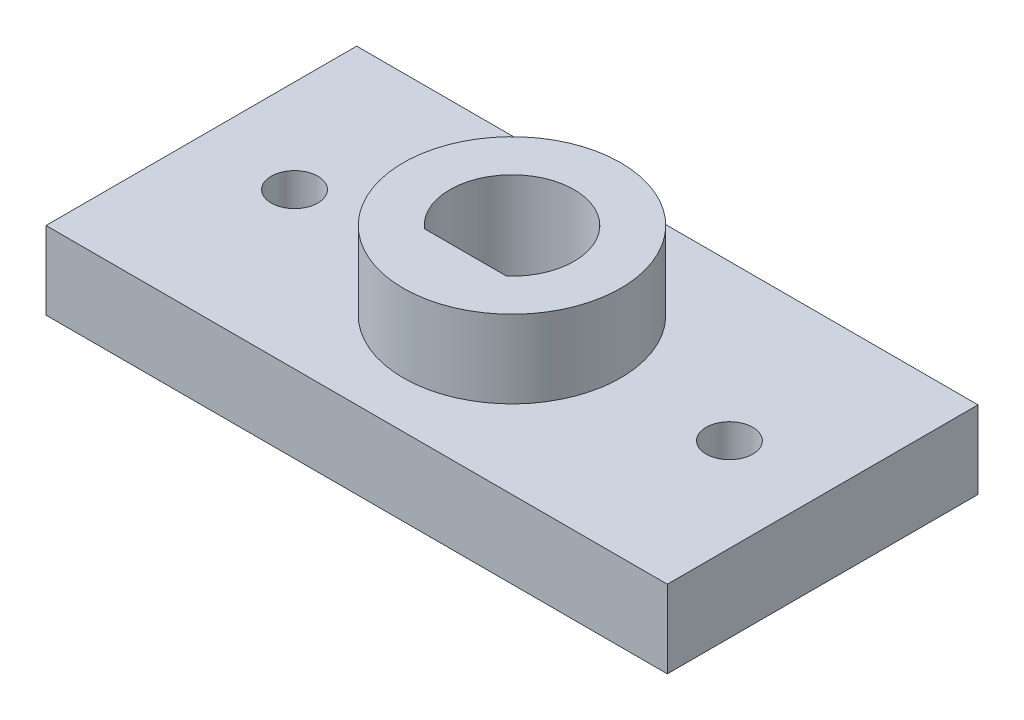
ISO-10303-21;
HEADER;
FILE_DESCRIPTION(('STEP AP214'),'2;1');
FILE_NAME('part.step','',(''),(''),'','','');
FILE_SCHEMA(('AUTOMOTIVE_DESIGN { 1 0 10303 214 1 1 1 1 }'));
ENDSEC;
DATA;
#1=APPLICATION_CONTEXT('core data for automotive mechanical design processes');
#2=APPLICATION_PROTOCOL_DEFINITION('international standard','automotive_design',2000,#1);
#3=PRODUCT_CONTEXT('',#1,'mechanical');
#4=PRODUCT('Part','Part','',(#3));
#5=PRODUCT_RELATED_PRODUCT_CATEGORY('part','',(#4));
#6=PRODUCT_DEFINITION_FORMATION('','',#4);
#7=PRODUCT_DEFINITION_CONTEXT('part definition',#1,'design');
#8=PRODUCT_DEFINITION('design','',#6,#7);
#9=PRODUCT_DEFINITION_SHAPE('','',#8);
#10=(LENGTH_UNIT() NAMED_UNIT(*) SI_UNIT(.MILLI.,.METRE.));
#11=(NAMED_UNIT(*) PLANE_ANGLE_UNIT() SI_UNIT($,.RADIAN.));
#12=(NAMED_UNIT(*) SI_UNIT($,.STERADIAN.) SOLID_ANGLE_UNIT());
#13=UNCERTAINTY_MEASURE_WITH_UNIT(LENGTH_MEASURE(1.E-05),#10,'distance_accuracy_value','');
#14=(GEOMETRIC_REPRESENTATION_CONTEXT(3) GLOBAL_UNCERTAINTY_ASSIGNED_CONTEXT((#13)) GLOBAL_UNIT_ASSIGNED_CONTEXT((#10,
#11,#12)) REPRESENTATION_CONTEXT('',''));
#15=CARTESIAN_POINT('',(0.,0.,0.));
#16=DIRECTION('',(0.,0.,1.));
#17=DIRECTION('',(1.,0.,0.));
#18=AXIS2_PLACEMENT_3D('',#15,#16,#17);
#19=CARTESIAN_POINT('',(0.,5.,0.));
#20=DIRECTION('',(0.,1.,0.));
#21=DIRECTION('',(0.,0.,1.));
#22=AXIS2_PLACEMENT_3D('',#19,#20,#21);
#23=PLANE('',#22);
#24=CARTESIAN_POINT('',(0.,5.,0.));
#25=DIRECTION('',(0.,1.,0.));
#26=DIRECTION('',(0.,0.,1.));
#27=AXIS2_PLACEMENT_3D('',#24,#25,#26);
#28=CIRCLE('',#27,7.);
#29=CARTESIAN_POINT('',(0.,5.,7.));
#30=VERTEX_POINT('',#29);
#31=EDGE_CURVE('E114',#30,#30,#28,.T.);
#32=ORIENTED_EDGE('',*,*,#31,.F.);
#33=EDGE_LOOP('',(#32));
#34=FACE_BOUND('',#33,.T.);
#35=CARTESIAN_POINT('',(14.,5.,0.));
#36=DIRECTION('',(0.,1.,0.));
#37=DIRECTION('',(0.,0.,1.));
#38=AXIS2_PLACEMENT_3D('',#35,#36,#37);
#39=CIRCLE('',#38,1.5);
#40=CARTESIAN_POINT('',(14.,5.,1.5));
#41=VERTEX_POINT('',#40);
#42=EDGE_CURVE('E131',#41,#41,#39,.T.);
#43=ORIENTED_EDGE('',*,*,#42,.F.);
#44=EDGE_LOOP('',(#43));
#45=FACE_BOUND('',#44,.T.);
#46=DIRECTION('',(0.,0.,-1.));
#47=VECTOR('',#46,1.);
#48=CARTESIAN_POINT('',(20.,5.,-10.));
#49=LINE('',#48,#47);
#50=CARTESIAN_POINT('',(20.,5.,10.));
#51=VERTEX_POINT('',#50);
#52=CARTESIAN_POINT('',(20.,5.,-10.));
#53=VERTEX_POINT('',#52);
#54=EDGE_CURVE('E137',#51,#53,#49,.T.);
#55=ORIENTED_EDGE('',*,*,#54,.T.);
#56=DIRECTION('',(-1.,0.,0.));
#57=VECTOR('',#56,1.);
#58=CARTESIAN_POINT('',(-20.,5.,-10.));
#59=LINE('',#58,#57);
#60=CARTESIAN_POINT('',(-20.,5.,-10.));
#61=VERTEX_POINT('',#60);
#62=EDGE_CURVE('E87',#53,#61,#59,.T.);
#63=ORIENTED_EDGE('',*,*,#62,.T.);
#64=DIRECTION('',(0.,0.,1.));
#65=VECTOR('',#64,1.);
#66=CARTESIAN_POINT('',(-20.,5.,-10.));
#67=LINE('',#66,#65);
#68=CARTESIAN_POINT('',(-20.,5.,10.));
#69=VERTEX_POINT('',#68);
#70=EDGE_CURVE('E140',#61,#69,#67,.T.);
#71=ORIENTED_EDGE('',*,*,#70,.T.);
#72=DIRECTION('',(1.,0.,0.));
#73=VECTOR('',#72,1.);
#74=CARTESIAN_POINT('',(-20.,5.,10.));
#75=LINE('',#74,#73);
#76=EDGE_CURVE('E59',#69,#51,#75,.T.);
#77=ORIENTED_EDGE('',*,*,#76,.T.);
#78=EDGE_LOOP('',(#55,#63,#71,#77));
#79=FACE_BOUND('',#78,.T.);
#80=CARTESIAN_POINT('',(-14.,5.,0.));
#81=DIRECTION('',(0.,1.,0.));
#82=DIRECTION('',(0.,0.,1.));
#83=AXIS2_PLACEMENT_3D('',#80,#81,#82);
#84=CIRCLE('',#83,1.5);
#85=CARTESIAN_POINT('',(-14.,5.,1.5));
#86=VERTEX_POINT('',#85);
#87=EDGE_CURVE('E125',#86,#86,#84,.T.);
#88=ORIENTED_EDGE('',*,*,#87,.F.);
#89=EDGE_LOOP('',(#88));
#90=FACE_BOUND('',#89,.T.);
#91=ADVANCED_FACE('F35',(#34,#45,#79,#90),#23,.T.);
#92=CARTESIAN_POINT('',(0.,0.,0.));
#93=DIRECTION('',(0.,1.,0.));
#94=DIRECTION('',(0.,0.,1.));
#95=AXIS2_PLACEMENT_3D('',#92,#93,#94);
#96=PLANE('',#95);
#97=CARTESIAN_POINT('',(-14.,0.,0.));
#98=DIRECTION('',(0.,1.,0.));
#99=DIRECTION('',(0.,0.,1.));
#100=AXIS2_PLACEMENT_3D('',#97,#98,#99);
#101=CIRCLE('',#100,1.5);
#102=CARTESIAN_POINT('',(-14.,0.,1.5));
#103=VERTEX_POINT('',#102);
#104=EDGE_CURVE('E124',#103,#103,#101,.T.);
#105=ORIENTED_EDGE('',*,*,#104,.T.);
#106=EDGE_LOOP('',(#105));
#107=FACE_BOUND('',#106,.T.);
#108=CARTESIAN_POINT('',(14.,0.,0.));
#109=DIRECTION('',(0.,1.,0.));
#110=DIRECTION('',(0.,0.,1.));
#111=AXIS2_PLACEMENT_3D('',#108,#109,#110);
#112=CIRCLE('',#111,1.5);
#113=CARTESIAN_POINT('',(14.,0.,1.5));
#114=VERTEX_POINT('',#113);
#115=EDGE_CURVE('E128',#114,#114,#112,.T.);
#116=ORIENTED_EDGE('',*,*,#115,.T.);
#117=EDGE_LOOP('',(#116));
#118=FACE_BOUND('',#117,.T.);
#119=DIRECTION('',(0.,0.,-1.));
#120=VECTOR('',#119,1.);
#121=CARTESIAN_POINT('',(20.,0.,-10.));
#122=LINE('',#121,#120);
#123=CARTESIAN_POINT('',(20.,0.,10.));
#124=VERTEX_POINT('',#123);
#125=CARTESIAN_POINT('',(20.,0.,-10.));
#126=VERTEX_POINT('',#125);
#127=EDGE_CURVE('E134',#124,#126,#122,.T.);
#128=ORIENTED_EDGE('',*,*,#127,.F.);
#129=DIRECTION('',(1.,0.,0.));
#130=VECTOR('',#129,1.);
#131=CARTESIAN_POINT('',(-20.,0.,10.));
#132=LINE('',#131,#130);
#133=CARTESIAN_POINT('',(-20.,0.,10.));
#134=VERTEX_POINT('',#133);
#135=EDGE_CURVE('E80',#134,#124,#132,.T.);
#136=ORIENTED_EDGE('',*,*,#135,.F.);
#137=DIRECTION('',(0.,0.,1.));
#138=VECTOR('',#137,1.);
#139=CARTESIAN_POINT('',(-20.,0.,-10.));
#140=LINE('',#139,#138);
#141=CARTESIAN_POINT('',(-20.,0.,-10.));
#142=VERTEX_POINT('',#141);
#143=EDGE_CURVE('E148',#142,#134,#140,.T.);
#144=ORIENTED_EDGE('',*,*,#143,.F.);
#145=DIRECTION('',(-1.,0.,0.));
#146=VECTOR('',#145,1.);
#147=CARTESIAN_POINT('',(-20.,0.,-10.));
#148=LINE('',#147,#146);
#149=EDGE_CURVE('E146',#126,#142,#148,.T.);
#150=ORIENTED_EDGE('',*,*,#149,.F.);
#151=EDGE_LOOP('',(#128,#136,#144,#150));
#152=FACE_BOUND('',#151,.T.);
#153=CARTESIAN_POINT('',(0.,0.,0.));
#154=DIRECTION('',(0.,1.,0.));
#155=DIRECTION('',(0.,0.,-1.));
#156=AXIS2_PLACEMENT_3D('',#153,#154,#155);
#157=CIRCLE('',#156,4.);
#158=CARTESIAN_POINT('',(2.64575131106459,0.,3.));
#159=VERTEX_POINT('',#158);
#160=CARTESIAN_POINT('',(-2.64575131106459,0.,3.));
#161=VERTEX_POINT('',#160);
#162=EDGE_CURVE('E50',#159,#161,#157,.T.);
#163=ORIENTED_EDGE('',*,*,#162,.T.);
#164=DIRECTION('',(1.,0.,0.));
#165=VECTOR('',#164,1.);
#166=CARTESIAN_POINT('',(-2.64575131106459,0.,3.));
#167=LINE('',#166,#165);
#168=EDGE_CURVE('E104',#161,#159,#167,.T.);
#169=ORIENTED_EDGE('',*,*,#168,.T.);
#170=EDGE_LOOP('',(#163,#169));
#171=FACE_BOUND('',#170,.T.);
#172=ADVANCED_FACE('F161',(#107,#118,#152,#171),#96,.F.);
#173=CARTESIAN_POINT('',(20.,5.,-10.));
#174=DIRECTION('',(-1.,0.,0.));
#175=DIRECTION('',(0.,0.,1.));
#176=AXIS2_PLACEMENT_3D('',#173,#174,#175);
#177=PLANE('',#176);
#178=ORIENTED_EDGE('',*,*,#127,.T.);
#179=DIRECTION('',(0.,-1.,0.));
#180=VECTOR('',#179,1.);
#181=CARTESIAN_POINT('',(20.,5.,-10.));
#182=LINE('',#181,#180);
#183=EDGE_CURVE('E11',#53,#126,#182,.T.);
#184=ORIENTED_EDGE('',*,*,#183,.F.);
#185=ORIENTED_EDGE('',*,*,#54,.F.);
#186=DIRECTION('',(0.,-1.,0.));
#187=VECTOR('',#186,1.);
#188=CARTESIAN_POINT('',(20.,5.,10.));
#189=LINE('',#188,#187);
#190=EDGE_CURVE('E143',#51,#124,#189,.T.);
#191=ORIENTED_EDGE('',*,*,#190,.T.);
#192=EDGE_LOOP('',(#178,#184,#185,#191));
#193=FACE_BOUND('',#192,.T.);
#194=ADVANCED_FACE('F37',(#193),#177,.F.);
#195=CARTESIAN_POINT('',(-20.,5.,-10.));
#196=DIRECTION('',(0.,0.,1.));
#197=DIRECTION('',(1.,0.,0.));
#198=AXIS2_PLACEMENT_3D('',#195,#196,#197);
#199=PLANE('',#198);
#200=ORIENTED_EDGE('',*,*,#149,.T.);
#201=DIRECTION('',(0.,-1.,0.));
#202=VECTOR('',#201,1.);
#203=CARTESIAN_POINT('',(-20.,5.,-10.));
#204=LINE('',#203,#202);
#205=EDGE_CURVE('E43',#61,#142,#204,.T.);
#206=ORIENTED_EDGE('',*,*,#205,.F.);
#207=ORIENTED_EDGE('',*,*,#62,.F.);
#208=ORIENTED_EDGE('',*,*,#183,.T.);
#209=EDGE_LOOP('',(#200,#206,#207,#208));
#210=FACE_BOUND('',#209,.T.);
#211=ADVANCED_FACE('F177',(#210),#199,.F.);
#212=CARTESIAN_POINT('',(-20.,5.,-10.));
#213=DIRECTION('',(1.,0.,0.));
#214=DIRECTION('',(0.,0.,-1.));
#215=AXIS2_PLACEMENT_3D('',#212,#213,#214);
#216=PLANE('',#215);
#217=ORIENTED_EDGE('',*,*,#143,.T.);
#218=DIRECTION('',(0.,-1.,0.));
#219=VECTOR('',#218,1.);
#220=CARTESIAN_POINT('',(-20.,5.,10.));
#221=LINE('',#220,#219);
#222=EDGE_CURVE('E152',#69,#134,#221,.T.);
#223=ORIENTED_EDGE('',*,*,#222,.F.);
#224=ORIENTED_EDGE('',*,*,#70,.F.);
#225=ORIENTED_EDGE('',*,*,#205,.T.);
#226=EDGE_LOOP('',(#217,#223,#224,#225));
#227=FACE_BOUND('',#226,.T.);
#228=ADVANCED_FACE('F157',(#227),#216,.F.);
#229=CARTESIAN_POINT('',(-20.,5.,10.));
#230=DIRECTION('',(0.,0.,-1.));
#231=DIRECTION('',(-1.,0.,0.));
#232=AXIS2_PLACEMENT_3D('',#229,#230,#231);
#233=PLANE('',#232);
#234=ORIENTED_EDGE('',*,*,#135,.T.);
#235=ORIENTED_EDGE('',*,*,#190,.F.);
#236=ORIENTED_EDGE('',*,*,#76,.F.);
#237=ORIENTED_EDGE('',*,*,#222,.T.);
#238=EDGE_LOOP('',(#234,#235,#236,#237));
#239=FACE_BOUND('',#238,.T.);
#240=ADVANCED_FACE('F166',(#239),#233,.F.);
#241=CARTESIAN_POINT('',(14.,5.,0.));
#242=DIRECTION('',(0.,-1.,0.));
#243=DIRECTION('',(0.,0.,-1.));
#244=AXIS2_PLACEMENT_3D('',#241,#242,#243);
#245=CYLINDRICAL_SURFACE('',#244,1.5);
#246=ORIENTED_EDGE('',*,*,#42,.T.);
#247=EDGE_LOOP('',(#246));
#248=FACE_BOUND('',#247,.T.);
#249=ORIENTED_EDGE('',*,*,#115,.F.);
#250=EDGE_LOOP('',(#249));
#251=FACE_BOUND('',#250,.T.);
#252=ADVANCED_FACE('F168',(#248,#251),#245,.F.);
#253=CARTESIAN_POINT('',(-14.,5.,0.));
#254=DIRECTION('',(0.,-1.,0.));
#255=DIRECTION('',(0.,0.,-1.));
#256=AXIS2_PLACEMENT_3D('',#253,#254,#255);
#257=CYLINDRICAL_SURFACE('',#256,1.5);
#258=ORIENTED_EDGE('',*,*,#87,.T.);
#259=EDGE_LOOP('',(#258));
#260=FACE_BOUND('',#259,.T.);
#261=ORIENTED_EDGE('',*,*,#104,.F.);
#262=EDGE_LOOP('',(#261));
#263=FACE_BOUND('',#262,.T.);
#264=ADVANCED_FACE('F174',(#260,#263),#257,.F.);
#265=CARTESIAN_POINT('',(0.,5.,0.));
#266=DIRECTION('',(0.,-1.,0.));
#267=DIRECTION('',(0.,0.,-1.));
#268=AXIS2_PLACEMENT_3D('',#265,#266,#267);
#269=CYLINDRICAL_SURFACE('',#268,4.);
#270=ORIENTED_EDGE('',*,*,#162,.F.);
#271=DIRECTION('',(0.,-1.,0.));
#272=VECTOR('',#271,1.);
#273=CARTESIAN_POINT('',(2.64575131106459,5.,3.));
#274=LINE('',#273,#272);
#275=CARTESIAN_POINT('',(2.64575131106458,10.,3.));
#276=VERTEX_POINT('',#275);
#277=EDGE_CURVE('E96',#276,#159,#274,.T.);
#278=ORIENTED_EDGE('',*,*,#277,.F.);
#279=CARTESIAN_POINT('',(0.,10.,0.));
#280=DIRECTION('',(0.,1.,0.));
#281=DIRECTION('',(0.,0.,1.));
#282=AXIS2_PLACEMENT_3D('',#279,#280,#281);
#283=CIRCLE('',#282,4.);
#284=CARTESIAN_POINT('',(-2.64575131106458,10.,3.));
#285=VERTEX_POINT('',#284);
#286=EDGE_CURVE('E100',#285,#276,#283,.F.);
#287=ORIENTED_EDGE('',*,*,#286,.F.);
#288=DIRECTION('',(0.,-1.,0.));
#289=VECTOR('',#288,1.);
#290=CARTESIAN_POINT('',(-2.64575131106459,5.,3.));
#291=LINE('',#290,#289);
#292=EDGE_CURVE('E103',#285,#161,#291,.T.);
#293=ORIENTED_EDGE('',*,*,#292,.T.);
#294=EDGE_LOOP('',(#270,#278,#287,#293));
#295=FACE_BOUND('',#294,.T.);
#296=ADVANCED_FACE('F98',(#295),#269,.F.);
#297=CARTESIAN_POINT('',(-2.64575131106459,5.,3.));
#298=DIRECTION('',(0.,0.,-1.));
#299=DIRECTION('',(-1.,0.,0.));
#300=AXIS2_PLACEMENT_3D('',#297,#298,#299);
#301=PLANE('',#300);
#302=ORIENTED_EDGE('',*,*,#168,.F.);
#303=ORIENTED_EDGE('',*,*,#292,.F.);
#304=DIRECTION('',(-1.,0.,0.));
#305=VECTOR('',#304,1.);
#306=CARTESIAN_POINT('',(0.,10.,3.));
#307=LINE('',#306,#305);
#308=EDGE_CURVE('E107',#276,#285,#307,.T.);
#309=ORIENTED_EDGE('',*,*,#308,.F.);
#310=ORIENTED_EDGE('',*,*,#277,.T.);
#311=EDGE_LOOP('',(#302,#303,#309,#310));
#312=FACE_BOUND('',#311,.T.);
#313=ADVANCED_FACE('F108',(#312),#301,.T.);
#314=CARTESIAN_POINT('',(0.,10.,0.));
#315=DIRECTION('',(0.,-1.,0.));
#316=DIRECTION('',(0.,0.,-1.));
#317=AXIS2_PLACEMENT_3D('',#314,#315,#316);
#318=CYLINDRICAL_SURFACE('',#317,7.);
#319=CARTESIAN_POINT('',(0.,10.,0.));
#320=DIRECTION('',(0.,1.,0.));
#321=DIRECTION('',(0.,0.,1.));
#322=AXIS2_PLACEMENT_3D('',#319,#320,#321);
#323=CIRCLE('',#322,7.);
#324=CARTESIAN_POINT('',(0.,10.,7.));
#325=VERTEX_POINT('',#324);
#326=EDGE_CURVE('E110',#325,#325,#323,.T.);
#327=ORIENTED_EDGE('',*,*,#326,.F.);
#328=EDGE_LOOP('',(#327));
#329=FACE_BOUND('',#328,.T.);
#330=ORIENTED_EDGE('',*,*,#31,.T.);
#331=EDGE_LOOP('',(#330));
#332=FACE_BOUND('',#331,.T.);
#333=ADVANCED_FACE('F197',(#329,#332),#318,.T.);
#334=CARTESIAN_POINT('',(0.,10.,0.));
#335=DIRECTION('',(0.,1.,0.));
#336=DIRECTION('',(0.,0.,1.));
#337=AXIS2_PLACEMENT_3D('',#334,#335,#336);
#338=PLANE('',#337);
#339=ORIENTED_EDGE('',*,*,#286,.T.);
#340=ORIENTED_EDGE('',*,*,#308,.T.);
#341=EDGE_LOOP('',(#339,#340));
#342=FACE_BOUND('',#341,.T.);
#343=ORIENTED_EDGE('',*,*,#326,.T.);
#344=EDGE_LOOP('',(#343));
#345=FACE_BOUND('',#344,.T.);
#346=ADVANCED_FACE('F112',(#342,#345),#338,.T.);
#347=CLOSED_SHELL('',(#91,#172,#194,#211,#228,#240,#252,#264,#296,#313,#333,#346));
#348=MANIFOLD_SOLID_BREP('B2',#347);
#349=ADVANCED_BREP_SHAPE_REPRESENTATION('',(#18,#348),#14);
#350=SHAPE_DEFINITION_REPRESENTATION(#9,#349);
ENDSEC;
END-ISO-10303-21;
